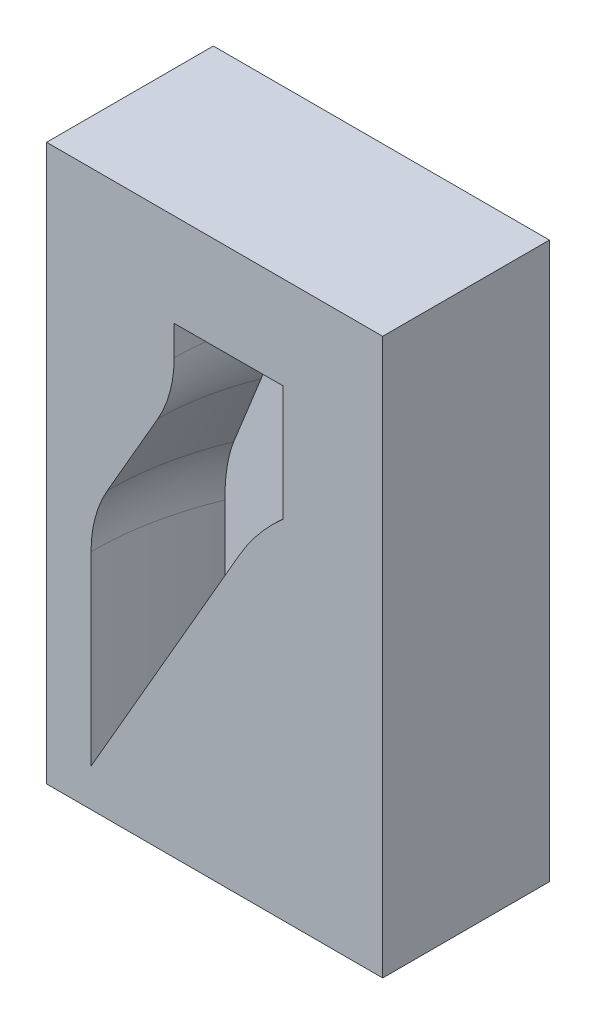
ISO-10303-21;
HEADER;
FILE_DESCRIPTION(('STEP AP214'),'2;1');
FILE_NAME('part.step','',(''),(''),'','','');
FILE_SCHEMA(('AUTOMOTIVE_DESIGN { 1 0 10303 214 1 1 1 1 }'));
ENDSEC;
DATA;
#1=APPLICATION_CONTEXT('core data for automotive mechanical design processes');
#2=APPLICATION_PROTOCOL_DEFINITION('international standard','automotive_design',2000,#1);
#3=PRODUCT_CONTEXT('',#1,'mechanical');
#4=PRODUCT('Part','Part','',(#3));
#5=PRODUCT_RELATED_PRODUCT_CATEGORY('part','',(#4));
#6=PRODUCT_DEFINITION_FORMATION('','',#4);
#7=PRODUCT_DEFINITION_CONTEXT('part definition',#1,'design');
#8=PRODUCT_DEFINITION('design','',#6,#7);
#9=PRODUCT_DEFINITION_SHAPE('','',#8);
#10=(LENGTH_UNIT() NAMED_UNIT(*) SI_UNIT(.MILLI.,.METRE.));
#11=(NAMED_UNIT(*) PLANE_ANGLE_UNIT() SI_UNIT($,.RADIAN.));
#12=(NAMED_UNIT(*) SI_UNIT($,.STERADIAN.) SOLID_ANGLE_UNIT());
#13=UNCERTAINTY_MEASURE_WITH_UNIT(LENGTH_MEASURE(1.E-05),#10,'distance_accuracy_value','');
#14=(GEOMETRIC_REPRESENTATION_CONTEXT(3) GLOBAL_UNCERTAINTY_ASSIGNED_CONTEXT((#13)) GLOBAL_UNIT_ASSIGNED_CONTEXT((#10,
#11,#12)) REPRESENTATION_CONTEXT('',''));
#15=CARTESIAN_POINT('',(0.,0.,0.));
#16=DIRECTION('',(0.,0.,1.));
#17=DIRECTION('',(1.,0.,0.));
#18=AXIS2_PLACEMENT_3D('',#15,#16,#17);
#19=CARTESIAN_POINT('',(-15.1192764526185,4.16703048843533,0.));
#20=DIRECTION('',(0.,0.,1.));
#21=DIRECTION('',(1.,0.,0.));
#22=AXIS2_PLACEMENT_3D('',#19,#20,#21);
#23=PLANE('',#22);
#24=DIRECTION('',(1.,0.,0.));
#25=VECTOR('',#24,1.);
#26=CARTESIAN_POINT('',(-30.2385529052369,-20.8329695115647,0.));
#27=LINE('',#26,#25);
#28=CARTESIAN_POINT('',(-30.2385529052369,-20.8329695115647,0.));
#29=VERTEX_POINT('',#28);
#30=CARTESIAN_POINT('',(0.,-20.8329695115647,0.));
#31=VERTEX_POINT('',#30);
#32=EDGE_CURVE('E203',#29,#31,#27,.T.);
#33=ORIENTED_EDGE('',*,*,#32,.T.);
#34=DIRECTION('',(0.,1.,0.));
#35=VECTOR('',#34,1.);
#36=CARTESIAN_POINT('',(0.,29.1670304884353,0.));
#37=LINE('',#36,#35);
#38=CARTESIAN_POINT('',(0.,29.1670304884353,0.));
#39=VERTEX_POINT('',#38);
#40=EDGE_CURVE('E158',#31,#39,#37,.T.);
#41=ORIENTED_EDGE('',*,*,#40,.T.);
#42=DIRECTION('',(-1.,0.,0.));
#43=VECTOR('',#42,1.);
#44=CARTESIAN_POINT('',(-30.238552905237,29.1670304884353,0.));
#45=LINE('',#44,#43);
#46=CARTESIAN_POINT('',(-30.238552905237,29.1670304884353,0.));
#47=VERTEX_POINT('',#46);
#48=EDGE_CURVE('E209',#39,#47,#45,.T.);
#49=ORIENTED_EDGE('',*,*,#48,.T.);
#50=DIRECTION('',(0.,-1.,0.));
#51=VECTOR('',#50,1.);
#52=CARTESIAN_POINT('',(-30.238552905237,29.1670304884353,0.));
#53=LINE('',#52,#51);
#54=EDGE_CURVE('E206',#47,#29,#53,.T.);
#55=ORIENTED_EDGE('',*,*,#54,.T.);
#56=EDGE_LOOP('',(#33,#41,#49,#55));
#57=FACE_BOUND('',#56,.T.);
#58=DIRECTION('',(-0.499904502194789,-0.866080532447982,0.));
#59=VECTOR('',#58,1.);
#60=CARTESIAN_POINT('',(0.,47.6762240448002,0.));
#61=LINE('',#60,#59);
#62=CARTESIAN_POINT('',(-24.7668755582752,4.76781118512613,0.));
#63=VERTEX_POINT('',#62);
#64=CARTESIAN_POINT('',(-20.2341787906284,12.6206719069507,0.));
#65=VERTEX_POINT('',#64);
#66=EDGE_CURVE('E200',#63,#65,#61,.F.);
#67=ORIENTED_EDGE('',*,*,#66,.T.);
#68=CARTESIAN_POINT('',(-29.7610646475562,18.1196214310934,0.));
#69=DIRECTION('',(0.,0.,1.));
#70=DIRECTION('',(1.,0.,0.));
#71=AXIS2_PLACEMENT_3D('',#68,#69,#70);
#72=CIRCLE('',#71,11.);
#73=CARTESIAN_POINT('',(-18.7610646475562,18.1196214310934,0.));
#74=VERTEX_POINT('',#73);
#75=EDGE_CURVE('E151',#65,#74,#72,.T.);
#76=ORIENTED_EDGE('',*,*,#75,.T.);
#77=DIRECTION('',(0.,1.,0.));
#78=VECTOR('',#77,1.);
#79=CARTESIAN_POINT('',(-18.7610646475562,0.,0.));
#80=LINE('',#79,#78);
#81=CARTESIAN_POINT('',(-18.7610646475562,20.7938985221382,0.));
#82=VERTEX_POINT('',#81);
#83=EDGE_CURVE('E134',#74,#82,#80,.T.);
#84=ORIENTED_EDGE('',*,*,#83,.T.);
#85=DIRECTION('',(-0.999994920931859,-0.0031871790796337,0.));
#86=VECTOR('',#85,1.);
#87=CARTESIAN_POINT('',(0.,20.8536936985984,0.));
#88=LINE('',#87,#86);
#89=CARTESIAN_POINT('',(-8.98379853062893,20.8250605784363,0.));
#90=VERTEX_POINT('',#89);
#91=EDGE_CURVE('E142',#82,#90,#88,.F.);
#92=ORIENTED_EDGE('',*,*,#91,.T.);
#93=DIRECTION('',(0.,1.,0.));
#94=VECTOR('',#93,1.);
#95=CARTESIAN_POINT('',(-8.98379853062893,0.,0.));
#96=LINE('',#95,#94);
#97=CARTESIAN_POINT('',(-8.98379853062893,10.4057850554509,0.));
#98=VERTEX_POINT('',#97);
#99=EDGE_CURVE('E147',#90,#98,#96,.F.);
#100=ORIENTED_EDGE('',*,*,#99,.T.);
#101=CARTESIAN_POINT('',(3.21963126821364,-3.66090111635775,0.));
#102=DIRECTION('',(0.,0.,1.));
#103=DIRECTION('',(1.,0.,0.));
#104=AXIS2_PLACEMENT_3D('',#101,#102,#103);
#105=CIRCLE('',#104,18.6224423401291);
#106=CARTESIAN_POINT('',(-12.9089035092073,5.64854165133557,0.));
#107=VERTEX_POINT('',#106);
#108=EDGE_CURVE('E186',#98,#107,#105,.T.);
#109=ORIENTED_EDGE('',*,*,#108,.T.);
#110=DIRECTION('',(-0.499904502194787,-0.866080532447983,0.));
#111=VECTOR('',#110,1.);
#112=CARTESIAN_POINT('',(0.,28.0131132354849,0.));
#113=LINE('',#112,#111);
#114=CARTESIAN_POINT('',(-26.2399897013474,-17.4474580380208,0.));
#115=VERTEX_POINT('',#114);
#116=EDGE_CURVE('E190',#107,#115,#113,.T.);
#117=ORIENTED_EDGE('',*,*,#116,.T.);
#118=DIRECTION('',(0.,1.,0.));
#119=VECTOR('',#118,1.);
#120=CARTESIAN_POINT('',(-26.2399897013474,0.,0.));
#121=LINE('',#120,#119);
#122=CARTESIAN_POINT('',(-26.2399897013474,-0.731138339016555,0.));
#123=VERTEX_POINT('',#122);
#124=EDGE_CURVE('E194',#115,#123,#121,.T.);
#125=ORIENTED_EDGE('',*,*,#124,.T.);
#126=CARTESIAN_POINT('',(-15.2399897013474,-0.731138339016555,0.));
#127=DIRECTION('',(0.,0.,1.));
#128=DIRECTION('',(1.,0.,0.));
#129=AXIS2_PLACEMENT_3D('',#126,#127,#128);
#130=CIRCLE('',#129,11.);
#131=EDGE_CURVE('E197',#123,#63,#130,.F.);
#132=ORIENTED_EDGE('',*,*,#131,.T.);
#133=EDGE_LOOP('',(#67,#76,#84,#92,#100,#109,#117,#125,#132));
#134=FACE_BOUND('',#133,.T.);
#135=ADVANCED_FACE('F32',(#57,#134),#23,.T.);
#136=CARTESIAN_POINT('',(0.,18.1196214310934,0.));
#137=DIRECTION('',(0.,1.,0.));
#138=DIRECTION('',(-1.,0.,0.));
#139=AXIS2_PLACEMENT_3D('',#136,#137,#138);
#140=TOROIDAL_SURFACE('',#139,29.7610646475562,11.);
#141=ORIENTED_EDGE('',*,*,#75,.F.);
#142=CARTESIAN_POINT('',(0.,12.6206719069507,0.));
#143=DIRECTION('',(0.,1.,0.));
#144=DIRECTION('',(-1.,0.,0.));
#145=AXIS2_PLACEMENT_3D('',#142,#143,#144);
#146=CIRCLE('',#145,20.2341787906284);
#147=CARTESIAN_POINT('',(-18.6939436418356,12.6206719069507,-7.74328499068661));
#148=VERTEX_POINT('',#147);
#149=EDGE_CURVE('E49',#148,#65,#146,.T.);
#150=ORIENTED_EDGE('',*,*,#149,.F.);
#151=CARTESIAN_POINT('',(-27.4956384936224,18.1196214310934,-11.3890663701662));
#152=DIRECTION('',(0.382683432365091,0.,-0.923879532511287));
#153=DIRECTION('',(-0.923879532511287,0.,-0.382683432365091));
#154=AXIS2_PLACEMENT_3D('',#151,#152,#153);
#155=CIRCLE('',#154,11.);
#156=CARTESIAN_POINT('',(-17.3329636359983,18.1196214310934,-7.17954861415018));
#157=VERTEX_POINT('',#156);
#158=EDGE_CURVE('E11',#157,#148,#155,.T.);
#159=ORIENTED_EDGE('',*,*,#158,.F.);
#160=CARTESIAN_POINT('',(0.,18.1196214310934,0.));
#161=DIRECTION('',(0.,1.,0.));
#162=DIRECTION('',(-1.,0.,0.));
#163=AXIS2_PLACEMENT_3D('',#160,#161,#162);
#164=CIRCLE('',#163,18.7610646475562);
#165=EDGE_CURVE('E36',#157,#74,#164,.T.);
#166=ORIENTED_EDGE('',*,*,#165,.T.);
#167=EDGE_LOOP('',(#141,#150,#159,#166));
#168=FACE_BOUND('',#167,.T.);
#169=ADVANCED_FACE('F266',(#168),#140,.T.);
#170=CARTESIAN_POINT('',(0.,12.6206719069507,0.));
#171=DIRECTION('',(0.,-1.,0.));
#172=DIRECTION('',(1.,0.,0.));
#173=AXIS2_PLACEMENT_3D('',#170,#171,#172);
#174=CONICAL_SURFACE('',#173,20.2341787906284,0.523488507740986);
#175=ORIENTED_EDGE('',*,*,#66,.F.);
#176=CARTESIAN_POINT('',(0.,4.76781118512612,0.));
#177=DIRECTION('',(0.,1.,0.));
#178=DIRECTION('',(-1.,0.,0.));
#179=AXIS2_PLACEMENT_3D('',#176,#177,#178);
#180=CIRCLE('',#179,24.7668755582752);
#181=CARTESIAN_POINT('',(-22.8816094125445,4.76781118512613,-9.47787294759981));
#182=VERTEX_POINT('',#181);
#183=EDGE_CURVE('E56',#182,#63,#180,.T.);
#184=ORIENTED_EDGE('',*,*,#183,.F.);
#185=DIRECTION('',(-0.461851537788009,-0.866080532447982,-0.191305170754664));
#186=VECTOR('',#185,1.);
#187=CARTESIAN_POINT('',(-22.8816094125445,4.76781118512613,-9.47787294759981));
#188=LINE('',#187,#186);
#189=EDGE_CURVE('E41',#148,#182,#188,.T.);
#190=ORIENTED_EDGE('',*,*,#189,.F.);
#191=ORIENTED_EDGE('',*,*,#149,.T.);
#192=EDGE_LOOP('',(#175,#184,#190,#191));
#193=FACE_BOUND('',#192,.T.);
#194=ADVANCED_FACE('F268',(#193),#174,.F.);
#195=CARTESIAN_POINT('',(0.,-0.731138339016561,0.));
#196=DIRECTION('',(0.,1.,0.));
#197=DIRECTION('',(-1.,0.,0.));
#198=AXIS2_PLACEMENT_3D('',#195,#196,#197);
#199=TOROIDAL_SURFACE('',#198,15.2399897013474,11.);
#200=ORIENTED_EDGE('',*,*,#131,.F.);
#201=CARTESIAN_POINT('',(0.,-0.731138339016564,0.));
#202=DIRECTION('',(0.,1.,0.));
#203=DIRECTION('',(-1.,0.,0.));
#204=AXIS2_PLACEMENT_3D('',#201,#202,#203);
#205=CIRCLE('',#204,26.2399897013474);
#206=CARTESIAN_POINT('',(-24.2425894183818,-0.731138339016556,-10.0416093241362));
#207=VERTEX_POINT('',#206);
#208=EDGE_CURVE('E168',#207,#123,#205,.T.);
#209=ORIENTED_EDGE('',*,*,#208,.F.);
#210=CARTESIAN_POINT('',(-14.0799145607576,-0.731138339016555,-5.83209156812024));
#211=DIRECTION('',(-0.382683432365091,0.,0.923879532511287));
#212=DIRECTION('',(0.923879532511287,0.,0.382683432365091));
#213=AXIS2_PLACEMENT_3D('',#210,#211,#212);
#214=CIRCLE('',#213,11.);
#215=EDGE_CURVE('E215',#182,#207,#214,.T.);
#216=ORIENTED_EDGE('',*,*,#215,.F.);
#217=ORIENTED_EDGE('',*,*,#183,.T.);
#218=EDGE_LOOP('',(#200,#209,#216,#217));
#219=FACE_BOUND('',#218,.T.);
#220=ADVANCED_FACE('F274',(#219),#199,.F.);
#221=CARTESIAN_POINT('',(0.,0.,0.));
#222=DIRECTION('',(0.,1.,0.));
#223=DIRECTION('',(-1.,0.,0.));
#224=AXIS2_PLACEMENT_3D('',#221,#222,#223);
#225=CYLINDRICAL_SURFACE('',#224,26.2399897013474);
#226=ORIENTED_EDGE('',*,*,#124,.F.);
#227=CARTESIAN_POINT('',(0.,-17.4474580380208,0.));
#228=DIRECTION('',(0.,1.,0.));
#229=DIRECTION('',(-1.,0.,0.));
#230=AXIS2_PLACEMENT_3D('',#227,#228,#229);
#231=CIRCLE('',#230,26.2399897013474);
#232=CARTESIAN_POINT('',(-24.2425894183818,-17.4474580380208,-10.0416093241362));
#233=VERTEX_POINT('',#232);
#234=EDGE_CURVE('E170',#233,#115,#231,.T.);
#235=ORIENTED_EDGE('',*,*,#234,.F.);
#236=DIRECTION('',(0.,-1.,0.));
#237=VECTOR('',#236,1.);
#238=CARTESIAN_POINT('',(-24.2425894183818,-17.4474580380208,-10.0416093241362));
#239=LINE('',#238,#237);
#240=EDGE_CURVE('E218',#207,#233,#239,.T.);
#241=ORIENTED_EDGE('',*,*,#240,.F.);
#242=ORIENTED_EDGE('',*,*,#208,.T.);
#243=EDGE_LOOP('',(#226,#235,#241,#242));
#244=FACE_BOUND('',#243,.T.);
#245=ADVANCED_FACE('F297',(#244),#225,.F.);
#246=CARTESIAN_POINT('',(0.,-17.4474580380208,0.));
#247=DIRECTION('',(0.,-1.,0.));
#248=DIRECTION('',(1.,0.,0.));
#249=AXIS2_PLACEMENT_3D('',#246,#247,#248);
#250=CONICAL_SURFACE('',#249,26.2399897013474,0.523488507740983);
#251=ORIENTED_EDGE('',*,*,#116,.F.);
#252=CARTESIAN_POINT('',(0.,5.64854165133556,0.));
#253=DIRECTION('',(0.,1.,0.));
#254=DIRECTION('',(-1.,0.,0.));
#255=AXIS2_PLACEMENT_3D('',#252,#253,#254);
#256=CIRCLE('',#255,12.9089035092073);
#257=CARTESIAN_POINT('',(-11.9262717393197,5.64854165133557,-4.9400235029732));
#258=VERTEX_POINT('',#257);
#259=EDGE_CURVE('E172',#258,#107,#256,.T.);
#260=ORIENTED_EDGE('',*,*,#259,.F.);
#261=DIRECTION('',(0.461851537788007,0.866080532447983,0.191305170754663));
#262=VECTOR('',#261,1.);
#263=CARTESIAN_POINT('',(-24.2425894183818,-17.4474580380208,-10.0416093241362));
#264=LINE('',#263,#262);
#265=EDGE_CURVE('E221',#233,#258,#264,.T.);
#266=ORIENTED_EDGE('',*,*,#265,.F.);
#267=ORIENTED_EDGE('',*,*,#234,.T.);
#268=EDGE_LOOP('',(#251,#260,#266,#267));
#269=FACE_BOUND('',#268,.T.);
#270=ADVANCED_FACE('F292',(#269),#250,.T.);
#271=CARTESIAN_POINT('',(0.,-3.66090111635775,0.));
#272=DIRECTION('',(0.,1.,0.));
#273=DIRECTION('',(-1.,0.,0.));
#274=AXIS2_PLACEMENT_3D('',#271,#272,#273);
#275=DEGENERATE_TOROIDAL_SURFACE('',#274,3.21963126821365,18.6224423401291,.F.);
#276=ORIENTED_EDGE('',*,*,#108,.F.);
#277=CARTESIAN_POINT('',(0.,10.4057850554509,0.));
#278=DIRECTION('',(0.,1.,0.));
#279=DIRECTION('',(-1.,0.,0.));
#280=AXIS2_PLACEMENT_3D('',#277,#278,#279);
#281=CIRCLE('',#280,8.98379853062893);
#282=CARTESIAN_POINT('',(-8.29994758665304,10.4057850554509,-3.43795085737754));
#283=VERTEX_POINT('',#282);
#284=EDGE_CURVE('E174',#283,#98,#281,.T.);
#285=ORIENTED_EDGE('',*,*,#284,.F.);
#286=CARTESIAN_POINT('',(2.97455143093594,-3.66090111635775,1.23209954466997));
#287=DIRECTION('',(0.382683432365091,0.,-0.923879532511287));
#288=DIRECTION('',(0.923879532511287,0.,0.382683432365091));
#289=AXIS2_PLACEMENT_3D('',#286,#287,#288);
#290=CIRCLE('',#289,18.6224423401291);
#291=EDGE_CURVE('E224',#258,#283,#290,.T.);
#292=ORIENTED_EDGE('',*,*,#291,.F.);
#293=ORIENTED_EDGE('',*,*,#259,.T.);
#294=EDGE_LOOP('',(#276,#285,#292,#293));
#295=FACE_BOUND('',#294,.T.);
#296=ADVANCED_FACE('F187',(#295),#275,.F.);
#297=CARTESIAN_POINT('',(0.,0.,0.));
#298=DIRECTION('',(0.,1.,0.));
#299=DIRECTION('',(-1.,0.,0.));
#300=AXIS2_PLACEMENT_3D('',#297,#298,#299);
#301=CYLINDRICAL_SURFACE('',#300,8.98379853062893);
#302=ORIENTED_EDGE('',*,*,#99,.F.);
#303=CARTESIAN_POINT('',(0.,20.8250605784363,0.));
#304=DIRECTION('',(0.,1.,0.));
#305=DIRECTION('',(-1.,0.,0.));
#306=AXIS2_PLACEMENT_3D('',#303,#304,#305);
#307=CIRCLE('',#306,8.98379853062894);
#308=CARTESIAN_POINT('',(-8.29994758665304,20.8250605784363,-3.43795085737754));
#309=VERTEX_POINT('',#308);
#310=EDGE_CURVE('E140',#309,#90,#307,.T.);
#311=ORIENTED_EDGE('',*,*,#310,.F.);
#312=DIRECTION('',(0.,1.,0.));
#313=VECTOR('',#312,1.);
#314=CARTESIAN_POINT('',(-8.29994758665304,20.8250605784363,-3.43795085737754));
#315=LINE('',#314,#313);
#316=EDGE_CURVE('E181',#283,#309,#315,.T.);
#317=ORIENTED_EDGE('',*,*,#316,.F.);
#318=ORIENTED_EDGE('',*,*,#284,.T.);
#319=EDGE_LOOP('',(#302,#311,#317,#318));
#320=FACE_BOUND('',#319,.T.);
#321=ADVANCED_FACE('F179',(#320),#301,.T.);
#322=CARTESIAN_POINT('',(0.,20.8250605784363,0.));
#323=DIRECTION('',(0.,-1.,0.));
#324=DIRECTION('',(1.,0.,0.));
#325=AXIS2_PLACEMENT_3D('',#322,#323,#324);
#326=CONICAL_SURFACE('',#325,8.98379853062894,1.56760914231929);
#327=ORIENTED_EDGE('',*,*,#91,.F.);
#328=CARTESIAN_POINT('',(0.,20.7938985221382,0.));
#329=DIRECTION('',(0.,1.,0.));
#330=DIRECTION('',(-1.,0.,0.));
#331=AXIS2_PLACEMENT_3D('',#328,#329,#330);
#332=CIRCLE('',#331,18.7610646475562);
#333=CARTESIAN_POINT('',(-17.3329636359983,20.7938985221382,-7.17954861415018));
#334=VERTEX_POINT('',#333);
#335=EDGE_CURVE('E130',#334,#82,#332,.T.);
#336=ORIENTED_EDGE('',*,*,#335,.F.);
#337=DIRECTION('',(-0.923874840064187,-0.00318717907963367,-0.382681488689861));
#338=VECTOR('',#337,1.);
#339=CARTESIAN_POINT('',(-17.3329636359983,20.7938985221382,-7.17954861415018));
#340=LINE('',#339,#338);
#341=EDGE_CURVE('E227',#309,#334,#340,.T.);
#342=ORIENTED_EDGE('',*,*,#341,.F.);
#343=ORIENTED_EDGE('',*,*,#310,.T.);
#344=EDGE_LOOP('',(#327,#336,#342,#343));
#345=FACE_BOUND('',#344,.T.);
#346=ADVANCED_FACE('F143',(#345),#326,.F.);
#347=CARTESIAN_POINT('',(0.,0.,0.));
#348=DIRECTION('',(0.,1.,0.));
#349=DIRECTION('',(-1.,0.,0.));
#350=AXIS2_PLACEMENT_3D('',#347,#348,#349);
#351=CYLINDRICAL_SURFACE('',#350,18.7610646475562);
#352=ORIENTED_EDGE('',*,*,#83,.F.);
#353=ORIENTED_EDGE('',*,*,#165,.F.);
#354=DIRECTION('',(0.,-1.,0.));
#355=VECTOR('',#354,1.);
#356=CARTESIAN_POINT('',(-17.3329636359983,18.1196214310934,-7.17954861415018));
#357=LINE('',#356,#355);
#358=EDGE_CURVE('E136',#334,#157,#357,.T.);
#359=ORIENTED_EDGE('',*,*,#358,.F.);
#360=ORIENTED_EDGE('',*,*,#335,.T.);
#361=EDGE_LOOP('',(#352,#353,#359,#360));
#362=FACE_BOUND('',#361,.T.);
#363=ADVANCED_FACE('F132',(#362),#351,.F.);
#364=CARTESIAN_POINT('',(-27.4956384936224,18.1196214310934,-11.3890663701662));
#365=DIRECTION('',(0.382683432365091,0.,-0.923879532511287));
#366=DIRECTION('',(-0.923879532511287,0.,-0.382683432365091));
#367=AXIS2_PLACEMENT_3D('',#364,#365,#366);
#368=PLANE('',#367);
#369=ORIENTED_EDGE('',*,*,#158,.T.);
#370=ORIENTED_EDGE('',*,*,#189,.T.);
#371=ORIENTED_EDGE('',*,*,#215,.T.);
#372=ORIENTED_EDGE('',*,*,#240,.T.);
#373=ORIENTED_EDGE('',*,*,#265,.T.);
#374=ORIENTED_EDGE('',*,*,#291,.T.);
#375=ORIENTED_EDGE('',*,*,#316,.T.);
#376=ORIENTED_EDGE('',*,*,#341,.T.);
#377=ORIENTED_EDGE('',*,*,#358,.T.);
#378=EDGE_LOOP('',(#369,#370,#371,#372,#373,#374,#375,#376,#377));
#379=FACE_BOUND('',#378,.T.);
#380=ADVANCED_FACE('F263',(#379),#368,.F.);
#381=CARTESIAN_POINT('',(0.,29.1670304884353,15.));
#382=DIRECTION('',(-1.,0.,0.));
#383=DIRECTION('',(0.,-1.,0.));
#384=AXIS2_PLACEMENT_3D('',#381,#382,#383);
#385=PLANE('',#384);
#386=ORIENTED_EDGE('',*,*,#40,.F.);
#387=DIRECTION('',(0.,0.,-1.));
#388=VECTOR('',#387,1.);
#389=CARTESIAN_POINT('',(0.,-20.8329695115647,15.));
#390=LINE('',#389,#388);
#391=CARTESIAN_POINT('',(0.,-20.8329695115647,-15.));
#392=VERTEX_POINT('',#391);
#393=EDGE_CURVE('E162',#31,#392,#390,.T.);
#394=ORIENTED_EDGE('',*,*,#393,.T.);
#395=DIRECTION('',(0.,1.,0.));
#396=VECTOR('',#395,1.);
#397=CARTESIAN_POINT('',(0.,29.1670304884353,-15.));
#398=LINE('',#397,#396);
#399=CARTESIAN_POINT('',(0.,29.1670304884353,-15.));
#400=VERTEX_POINT('',#399);
#401=EDGE_CURVE('E166',#392,#400,#398,.T.);
#402=ORIENTED_EDGE('',*,*,#401,.T.);
#403=DIRECTION('',(0.,0.,-1.));
#404=VECTOR('',#403,1.);
#405=CARTESIAN_POINT('',(0.,29.1670304884353,15.));
#406=LINE('',#405,#404);
#407=EDGE_CURVE('E155',#39,#400,#406,.T.);
#408=ORIENTED_EDGE('',*,*,#407,.F.);
#409=EDGE_LOOP('',(#386,#394,#402,#408));
#410=FACE_BOUND('',#409,.T.);
#411=ADVANCED_FACE('F249',(#410),#385,.F.);
#412=CARTESIAN_POINT('',(-30.238552905237,29.1670304884353,15.));
#413=DIRECTION('',(0.,-1.,0.));
#414=DIRECTION('',(0.,0.,-1.));
#415=AXIS2_PLACEMENT_3D('',#412,#413,#414);
#416=PLANE('',#415);
#417=ORIENTED_EDGE('',*,*,#48,.F.);
#418=ORIENTED_EDGE('',*,*,#407,.T.);
#419=DIRECTION('',(-1.,0.,0.));
#420=VECTOR('',#419,1.);
#421=CARTESIAN_POINT('',(-30.238552905237,29.1670304884353,-15.));
#422=LINE('',#421,#420);
#423=CARTESIAN_POINT('',(-30.238552905237,29.1670304884353,-15.));
#424=VERTEX_POINT('',#423);
#425=EDGE_CURVE('E232',#400,#424,#422,.T.);
#426=ORIENTED_EDGE('',*,*,#425,.T.);
#427=DIRECTION('',(0.,0.,-1.));
#428=VECTOR('',#427,1.);
#429=CARTESIAN_POINT('',(-30.238552905237,29.1670304884353,15.));
#430=LINE('',#429,#428);
#431=EDGE_CURVE('E157',#47,#424,#430,.T.);
#432=ORIENTED_EDGE('',*,*,#431,.F.);
#433=EDGE_LOOP('',(#417,#418,#426,#432));
#434=FACE_BOUND('',#433,.T.);
#435=ADVANCED_FACE('F256',(#434),#416,.F.);
#436=CARTESIAN_POINT('',(-30.238552905237,29.1670304884353,15.));
#437=DIRECTION('',(1.,0.,0.));
#438=DIRECTION('',(0.,1.,0.));
#439=AXIS2_PLACEMENT_3D('',#436,#437,#438);
#440=PLANE('',#439);
#441=ORIENTED_EDGE('',*,*,#54,.F.);
#442=ORIENTED_EDGE('',*,*,#431,.T.);
#443=DIRECTION('',(0.,-1.,0.));
#444=VECTOR('',#443,1.);
#445=CARTESIAN_POINT('',(-30.238552905237,29.1670304884353,-15.));
#446=LINE('',#445,#444);
#447=CARTESIAN_POINT('',(-30.2385529052369,-20.8329695115647,-15.));
#448=VERTEX_POINT('',#447);
#449=EDGE_CURVE('E235',#424,#448,#446,.T.);
#450=ORIENTED_EDGE('',*,*,#449,.T.);
#451=DIRECTION('',(0.,0.,-1.));
#452=VECTOR('',#451,1.);
#453=CARTESIAN_POINT('',(-30.2385529052369,-20.8329695115647,15.));
#454=LINE('',#453,#452);
#455=EDGE_CURVE('E160',#29,#448,#454,.T.);
#456=ORIENTED_EDGE('',*,*,#455,.F.);
#457=EDGE_LOOP('',(#441,#442,#450,#456));
#458=FACE_BOUND('',#457,.T.);
#459=ADVANCED_FACE('F254',(#458),#440,.F.);
#460=CARTESIAN_POINT('',(-30.2385529052369,-20.8329695115647,15.));
#461=DIRECTION('',(0.,1.,0.));
#462=DIRECTION('',(0.,0.,1.));
#463=AXIS2_PLACEMENT_3D('',#460,#461,#462);
#464=PLANE('',#463);
#465=ORIENTED_EDGE('',*,*,#32,.F.);
#466=ORIENTED_EDGE('',*,*,#455,.T.);
#467=DIRECTION('',(1.,0.,0.));
#468=VECTOR('',#467,1.);
#469=CARTESIAN_POINT('',(-30.2385529052369,-20.8329695115647,-15.));
#470=LINE('',#469,#468);
#471=EDGE_CURVE('E164',#448,#392,#470,.T.);
#472=ORIENTED_EDGE('',*,*,#471,.T.);
#473=ORIENTED_EDGE('',*,*,#393,.F.);
#474=EDGE_LOOP('',(#465,#466,#472,#473));
#475=FACE_BOUND('',#474,.T.);
#476=ADVANCED_FACE('F34',(#475),#464,.F.);
#477=CARTESIAN_POINT('',(-15.1192764526185,4.16703048843533,-15.));
#478=DIRECTION('',(0.,0.,1.));
#479=DIRECTION('',(1.,0.,0.));
#480=AXIS2_PLACEMENT_3D('',#477,#478,#479);
#481=PLANE('',#480);
#482=ORIENTED_EDGE('',*,*,#401,.F.);
#483=ORIENTED_EDGE('',*,*,#471,.F.);
#484=ORIENTED_EDGE('',*,*,#449,.F.);
#485=ORIENTED_EDGE('',*,*,#425,.F.);
#486=EDGE_LOOP('',(#482,#483,#484,#485));
#487=FACE_BOUND('',#486,.T.);
#488=ADVANCED_FACE('F247',(#487),#481,.F.);
#489=CLOSED_SHELL('',(#135,#169,#194,#220,#245,#270,#296,#321,#346,#363,#380,#411,#435,#459,
#476,#488));
#490=MANIFOLD_SOLID_BREP('B2',#489);
#491=ADVANCED_BREP_SHAPE_REPRESENTATION('',(#18,#490),#14);
#492=SHAPE_DEFINITION_REPRESENTATION(#9,#491);
ENDSEC;
END-ISO-10303-21;
